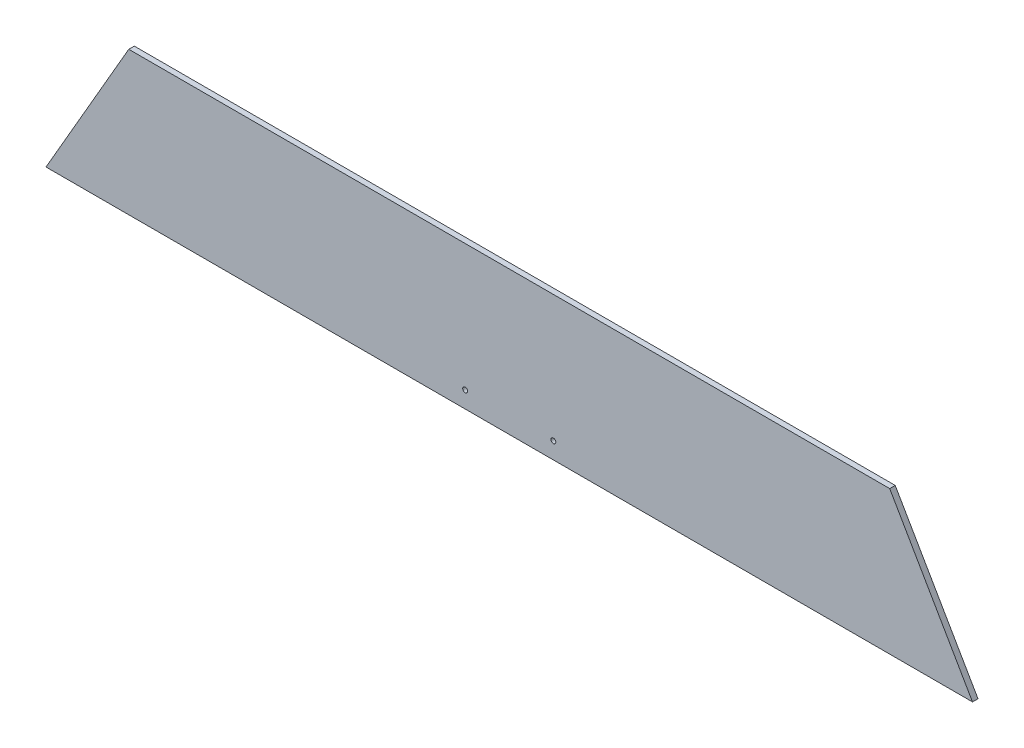
ISO-10303-21;
HEADER;
FILE_DESCRIPTION(('STEP AP214'),'2;1');
FILE_NAME('part.step','',(''),(''),'','','');
FILE_SCHEMA(('AUTOMOTIVE_DESIGN { 1 0 10303 214 1 1 1 1 }'));
ENDSEC;
DATA;
#1=APPLICATION_CONTEXT('core data for automotive mechanical design processes');
#2=APPLICATION_PROTOCOL_DEFINITION('international standard','automotive_design',2000,#1);
#3=PRODUCT_CONTEXT('',#1,'mechanical');
#4=PRODUCT('Part','Part','',(#3));
#5=PRODUCT_RELATED_PRODUCT_CATEGORY('part','',(#4));
#6=PRODUCT_DEFINITION_FORMATION('','',#4);
#7=PRODUCT_DEFINITION_CONTEXT('part definition',#1,'design');
#8=PRODUCT_DEFINITION('design','',#6,#7);
#9=PRODUCT_DEFINITION_SHAPE('','',#8);
#10=(LENGTH_UNIT() NAMED_UNIT(*) SI_UNIT(.MILLI.,.METRE.));
#11=(NAMED_UNIT(*) PLANE_ANGLE_UNIT() SI_UNIT($,.RADIAN.));
#12=(NAMED_UNIT(*) SI_UNIT($,.STERADIAN.) SOLID_ANGLE_UNIT());
#13=UNCERTAINTY_MEASURE_WITH_UNIT(LENGTH_MEASURE(1.E-05),#10,'distance_accuracy_value','');
#14=(GEOMETRIC_REPRESENTATION_CONTEXT(3) GLOBAL_UNCERTAINTY_ASSIGNED_CONTEXT((#13)) GLOBAL_UNIT_ASSIGNED_CONTEXT((#10,
#11,#12)) REPRESENTATION_CONTEXT('',''));
#15=CARTESIAN_POINT('',(0.,0.,0.));
#16=DIRECTION('',(0.,0.,1.));
#17=DIRECTION('',(1.,0.,0.));
#18=AXIS2_PLACEMENT_3D('',#15,#16,#17);
#19=CARTESIAN_POINT('',(-533.470529443207,0.,6.35));
#20=DIRECTION('',(0.86602540378444,-0.499999999999998,0.));
#21=DIRECTION('',(0.499999999999998,0.86602540378444,0.));
#22=AXIS2_PLACEMENT_3D('',#19,#20,#21);
#23=PLANE('',#22);
#24=DIRECTION('',(-0.499999999999998,-0.86602540378444,0.));
#25=VECTOR('',#24,1.);
#26=CARTESIAN_POINT('',(-533.470529443207,0.,0.));
#27=LINE('',#26,#25);
#28=CARTESIAN_POINT('',(-438.15,165.1,0.));
#29=VERTEX_POINT('',#28);
#30=CARTESIAN_POINT('',(-533.470529443207,0.,0.));
#31=VERTEX_POINT('',#30);
#32=EDGE_CURVE('E104',#29,#31,#27,.T.);
#33=ORIENTED_EDGE('',*,*,#32,.T.);
#34=DIRECTION('',(0.,0.,-1.));
#35=VECTOR('',#34,1.);
#36=CARTESIAN_POINT('',(-533.470529443207,0.,6.35));
#37=LINE('',#36,#35);
#38=CARTESIAN_POINT('',(-533.470529443207,0.,6.35));
#39=VERTEX_POINT('',#38);
#40=EDGE_CURVE('E11',#39,#31,#37,.T.);
#41=ORIENTED_EDGE('',*,*,#40,.F.);
#42=DIRECTION('',(-0.499999999999998,-0.86602540378444,0.));
#43=VECTOR('',#42,1.);
#44=CARTESIAN_POINT('',(-533.470529443207,0.,6.35));
#45=LINE('',#44,#43);
#46=CARTESIAN_POINT('',(-438.15,165.1,6.35));
#47=VERTEX_POINT('',#46);
#48=EDGE_CURVE('E92',#47,#39,#45,.T.);
#49=ORIENTED_EDGE('',*,*,#48,.F.);
#50=DIRECTION('',(0.,0.,-1.));
#51=VECTOR('',#50,1.);
#52=CARTESIAN_POINT('',(-438.15,165.1,6.35));
#53=LINE('',#52,#51);
#54=EDGE_CURVE('E100',#47,#29,#53,.T.);
#55=ORIENTED_EDGE('',*,*,#54,.T.);
#56=EDGE_LOOP('',(#33,#41,#49,#55));
#57=FACE_BOUND('',#56,.T.);
#58=ADVANCED_FACE('F41',(#57),#23,.F.);
#59=CARTESIAN_POINT('',(-533.470529443207,0.,6.35));
#60=DIRECTION('',(0.,1.,0.));
#61=DIRECTION('',(0.,0.,1.));
#62=AXIS2_PLACEMENT_3D('',#59,#60,#61);
#63=PLANE('',#62);
#64=DIRECTION('',(1.,0.,0.));
#65=VECTOR('',#64,1.);
#66=CARTESIAN_POINT('',(-533.470529443207,0.,0.));
#67=LINE('',#66,#65);
#68=CARTESIAN_POINT('',(533.470529443207,0.,0.));
#69=VERTEX_POINT('',#68);
#70=EDGE_CURVE('E96',#31,#69,#67,.T.);
#71=ORIENTED_EDGE('',*,*,#70,.T.);
#72=DIRECTION('',(0.,0.,-1.));
#73=VECTOR('',#72,1.);
#74=CARTESIAN_POINT('',(533.470529443207,0.,6.35));
#75=LINE('',#74,#73);
#76=CARTESIAN_POINT('',(533.470529443207,0.,6.35));
#77=VERTEX_POINT('',#76);
#78=EDGE_CURVE('E49',#77,#69,#75,.T.);
#79=ORIENTED_EDGE('',*,*,#78,.F.);
#80=DIRECTION('',(1.,0.,0.));
#81=VECTOR('',#80,1.);
#82=CARTESIAN_POINT('',(-533.470529443207,0.,6.35));
#83=LINE('',#82,#81);
#84=EDGE_CURVE('E87',#39,#77,#83,.T.);
#85=ORIENTED_EDGE('',*,*,#84,.F.);
#86=ORIENTED_EDGE('',*,*,#40,.T.);
#87=EDGE_LOOP('',(#71,#79,#85,#86));
#88=FACE_BOUND('',#87,.T.);
#89=ADVANCED_FACE('F95',(#88),#63,.F.);
#90=CARTESIAN_POINT('',(533.470529443207,0.,6.35));
#91=DIRECTION('',(-0.86602540378444,-0.499999999999998,0.));
#92=DIRECTION('',(0.499999999999998,-0.86602540378444,0.));
#93=AXIS2_PLACEMENT_3D('',#90,#91,#92);
#94=PLANE('',#93);
#95=DIRECTION('',(-0.499999999999998,0.86602540378444,0.));
#96=VECTOR('',#95,1.);
#97=CARTESIAN_POINT('',(533.470529443207,0.,0.));
#98=LINE('',#97,#96);
#99=CARTESIAN_POINT('',(438.15,165.1,0.));
#100=VERTEX_POINT('',#99);
#101=EDGE_CURVE('E74',#69,#100,#98,.T.);
#102=ORIENTED_EDGE('',*,*,#101,.T.);
#103=DIRECTION('',(0.,0.,-1.));
#104=VECTOR('',#103,1.);
#105=CARTESIAN_POINT('',(438.15,165.1,6.35));
#106=LINE('',#105,#104);
#107=CARTESIAN_POINT('',(438.15,165.1,6.35));
#108=VERTEX_POINT('',#107);
#109=EDGE_CURVE('E97',#108,#100,#106,.T.);
#110=ORIENTED_EDGE('',*,*,#109,.F.);
#111=DIRECTION('',(-0.499999999999998,0.86602540378444,0.));
#112=VECTOR('',#111,1.);
#113=CARTESIAN_POINT('',(533.470529443207,0.,6.35));
#114=LINE('',#113,#112);
#115=EDGE_CURVE('E90',#77,#108,#114,.T.);
#116=ORIENTED_EDGE('',*,*,#115,.F.);
#117=ORIENTED_EDGE('',*,*,#78,.T.);
#118=EDGE_LOOP('',(#102,#110,#116,#117));
#119=FACE_BOUND('',#118,.T.);
#120=ADVANCED_FACE('F98',(#119),#94,.F.);
#121=CARTESIAN_POINT('',(-438.15,165.1,6.35));
#122=DIRECTION('',(0.,-1.,0.));
#123=DIRECTION('',(0.,0.,-1.));
#124=AXIS2_PLACEMENT_3D('',#121,#122,#123);
#125=PLANE('',#124);
#126=DIRECTION('',(-1.,0.,0.));
#127=VECTOR('',#126,1.);
#128=CARTESIAN_POINT('',(-438.15,165.1,0.));
#129=LINE('',#128,#127);
#130=EDGE_CURVE('E80',#100,#29,#129,.T.);
#131=ORIENTED_EDGE('',*,*,#130,.T.);
#132=ORIENTED_EDGE('',*,*,#54,.F.);
#133=DIRECTION('',(-1.,0.,0.));
#134=VECTOR('',#133,1.);
#135=CARTESIAN_POINT('',(-438.15,165.1,6.35));
#136=LINE('',#135,#134);
#137=EDGE_CURVE('E57',#108,#47,#136,.T.);
#138=ORIENTED_EDGE('',*,*,#137,.F.);
#139=ORIENTED_EDGE('',*,*,#109,.T.);
#140=EDGE_LOOP('',(#131,#132,#138,#139));
#141=FACE_BOUND('',#140,.T.);
#142=ADVANCED_FACE('F112',(#141),#125,.F.);
#143=CARTESIAN_POINT('',(0.,0.,6.35));
#144=DIRECTION('',(0.,0.,-1.));
#145=DIRECTION('',(-1.,0.,0.));
#146=AXIS2_PLACEMENT_3D('',#143,#144,#145);
#147=PLANE('',#146);
#148=CARTESIAN_POINT('',(-50.8,19.05,6.35));
#149=DIRECTION('',(0.,0.,1.));
#150=DIRECTION('',(1.,0.,0.));
#151=AXIS2_PLACEMENT_3D('',#148,#149,#150);
#152=CIRCLE('',#151,2.8067);
#153=CARTESIAN_POINT('',(-47.9933,19.05,6.35));
#154=VERTEX_POINT('',#153);
#155=EDGE_CURVE('E126',#154,#154,#152,.T.);
#156=ORIENTED_EDGE('',*,*,#155,.F.);
#157=EDGE_LOOP('',(#156));
#158=FACE_BOUND('',#157,.T.);
#159=CARTESIAN_POINT('',(50.8,19.05,6.35));
#160=DIRECTION('',(0.,0.,1.));
#161=DIRECTION('',(1.,0.,0.));
#162=AXIS2_PLACEMENT_3D('',#159,#160,#161);
#163=CIRCLE('',#162,2.8067);
#164=CARTESIAN_POINT('',(53.6067,19.05,6.35));
#165=VERTEX_POINT('',#164);
#166=EDGE_CURVE('E120',#165,#165,#163,.T.);
#167=ORIENTED_EDGE('',*,*,#166,.F.);
#168=EDGE_LOOP('',(#167));
#169=FACE_BOUND('',#168,.T.);
#170=ORIENTED_EDGE('',*,*,#48,.T.);
#171=ORIENTED_EDGE('',*,*,#84,.T.);
#172=ORIENTED_EDGE('',*,*,#115,.T.);
#173=ORIENTED_EDGE('',*,*,#137,.T.);
#174=EDGE_LOOP('',(#170,#171,#172,#173));
#175=FACE_BOUND('',#174,.T.);
#176=ADVANCED_FACE('F88',(#158,#169,#175),#147,.F.);
#177=CARTESIAN_POINT('',(0.,0.,0.));
#178=DIRECTION('',(0.,0.,-1.));
#179=DIRECTION('',(-1.,0.,0.));
#180=AXIS2_PLACEMENT_3D('',#177,#178,#179);
#181=PLANE('',#180);
#182=CARTESIAN_POINT('',(-50.8,19.05,0.));
#183=DIRECTION('',(0.,0.,1.));
#184=DIRECTION('',(1.,0.,0.));
#185=AXIS2_PLACEMENT_3D('',#182,#183,#184);
#186=CIRCLE('',#185,2.8067);
#187=CARTESIAN_POINT('',(-47.9933,19.05,0.));
#188=VERTEX_POINT('',#187);
#189=EDGE_CURVE('E123',#188,#188,#186,.T.);
#190=ORIENTED_EDGE('',*,*,#189,.T.);
#191=EDGE_LOOP('',(#190));
#192=FACE_BOUND('',#191,.T.);
#193=CARTESIAN_POINT('',(50.8,19.05,0.));
#194=DIRECTION('',(0.,0.,1.));
#195=DIRECTION('',(1.,0.,0.));
#196=AXIS2_PLACEMENT_3D('',#193,#194,#195);
#197=CIRCLE('',#196,2.8067);
#198=CARTESIAN_POINT('',(53.6067,19.05,0.));
#199=VERTEX_POINT('',#198);
#200=EDGE_CURVE('E107',#199,#199,#197,.T.);
#201=ORIENTED_EDGE('',*,*,#200,.T.);
#202=EDGE_LOOP('',(#201));
#203=FACE_BOUND('',#202,.T.);
#204=ORIENTED_EDGE('',*,*,#32,.F.);
#205=ORIENTED_EDGE('',*,*,#130,.F.);
#206=ORIENTED_EDGE('',*,*,#101,.F.);
#207=ORIENTED_EDGE('',*,*,#70,.F.);
#208=EDGE_LOOP('',(#204,#205,#206,#207));
#209=FACE_BOUND('',#208,.T.);
#210=ADVANCED_FACE('F115',(#192,#203,#209),#181,.T.);
#211=CARTESIAN_POINT('',(50.8,19.05,6.35));
#212=DIRECTION('',(0.,0.,1.));
#213=DIRECTION('',(1.,0.,0.));
#214=AXIS2_PLACEMENT_3D('',#211,#212,#213);
#215=CYLINDRICAL_SURFACE('',#214,2.8067);
#216=ORIENTED_EDGE('',*,*,#200,.F.);
#217=EDGE_LOOP('',(#216));
#218=FACE_BOUND('',#217,.T.);
#219=ORIENTED_EDGE('',*,*,#166,.T.);
#220=EDGE_LOOP('',(#219));
#221=FACE_BOUND('',#220,.T.);
#222=ADVANCED_FACE('F137',(#218,#221),#215,.F.);
#223=CARTESIAN_POINT('',(-50.8,19.05,6.35));
#224=DIRECTION('',(0.,0.,1.));
#225=DIRECTION('',(1.,0.,0.));
#226=AXIS2_PLACEMENT_3D('',#223,#224,#225);
#227=CYLINDRICAL_SURFACE('',#226,2.8067);
#228=ORIENTED_EDGE('',*,*,#189,.F.);
#229=EDGE_LOOP('',(#228));
#230=FACE_BOUND('',#229,.T.);
#231=ORIENTED_EDGE('',*,*,#155,.T.);
#232=EDGE_LOOP('',(#231));
#233=FACE_BOUND('',#232,.T.);
#234=ADVANCED_FACE('F130',(#230,#233),#227,.F.);
#235=CLOSED_SHELL('',(#58,#89,#120,#142,#176,#210,#222,#234));
#236=MANIFOLD_SOLID_BREP('B2',#235);
#237=ADVANCED_BREP_SHAPE_REPRESENTATION('',(#18,#236),#14);
#238=SHAPE_DEFINITION_REPRESENTATION(#9,#237);
ENDSEC;
END-ISO-10303-21;
